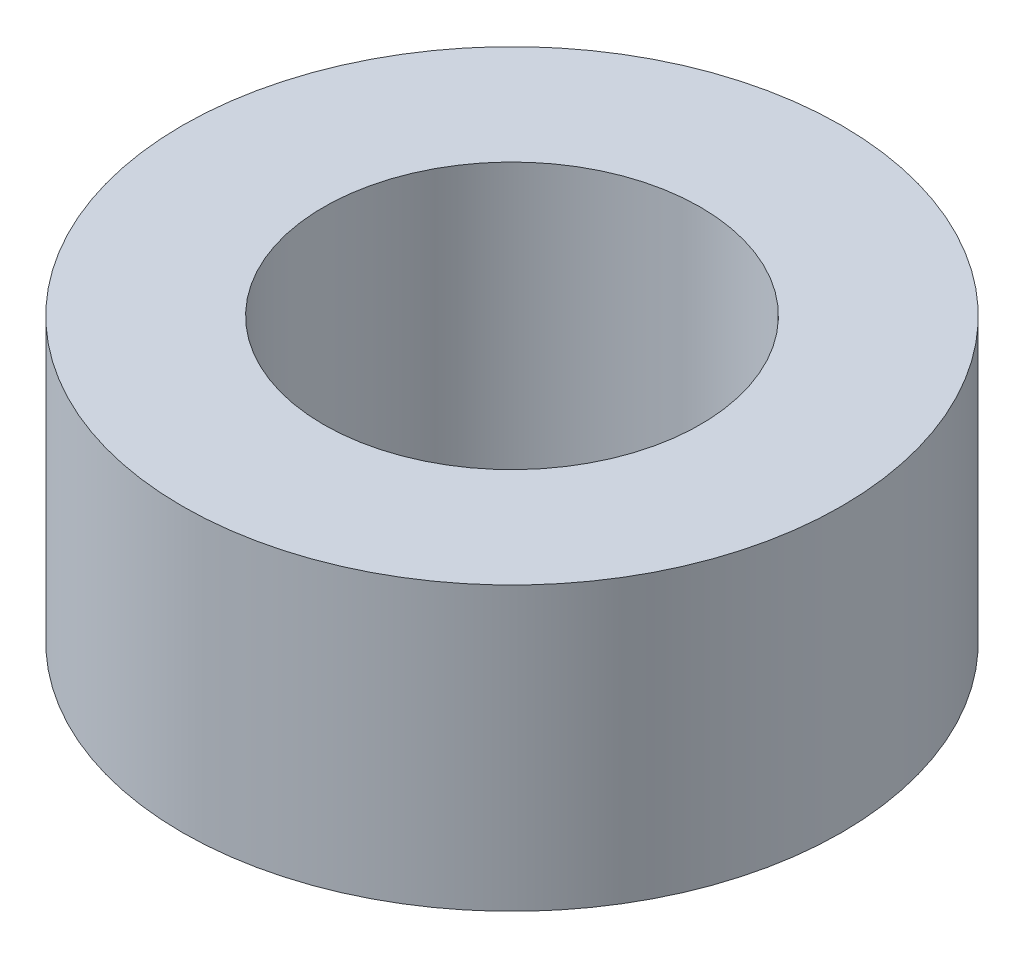
ISO-10303-21;
HEADER;
FILE_DESCRIPTION(('STEP AP214'),'2;1');
FILE_NAME('part.step','',(''),(''),'','','');
FILE_SCHEMA(('AUTOMOTIVE_DESIGN { 1 0 10303 214 1 1 1 1 }'));
ENDSEC;
DATA;
#1=APPLICATION_CONTEXT('core data for automotive mechanical design processes');
#2=APPLICATION_PROTOCOL_DEFINITION('international standard','automotive_design',2000,#1);
#3=PRODUCT_CONTEXT('',#1,'mechanical');
#4=PRODUCT('Part','Part','',(#3));
#5=PRODUCT_RELATED_PRODUCT_CATEGORY('part','',(#4));
#6=PRODUCT_DEFINITION_FORMATION('','',#4);
#7=PRODUCT_DEFINITION_CONTEXT('part definition',#1,'design');
#8=PRODUCT_DEFINITION('design','',#6,#7);
#9=PRODUCT_DEFINITION_SHAPE('','',#8);
#10=(LENGTH_UNIT() NAMED_UNIT(*) SI_UNIT(.MILLI.,.METRE.));
#11=(NAMED_UNIT(*) PLANE_ANGLE_UNIT() SI_UNIT($,.RADIAN.));
#12=(NAMED_UNIT(*) SI_UNIT($,.STERADIAN.) SOLID_ANGLE_UNIT());
#13=UNCERTAINTY_MEASURE_WITH_UNIT(LENGTH_MEASURE(1.E-05),#10,'distance_accuracy_value','');
#14=(GEOMETRIC_REPRESENTATION_CONTEXT(3) GLOBAL_UNCERTAINTY_ASSIGNED_CONTEXT((#13)) GLOBAL_UNIT_ASSIGNED_CONTEXT((#10,
#11,#12)) REPRESENTATION_CONTEXT('',''));
#15=CARTESIAN_POINT('',(0.,0.,0.));
#16=DIRECTION('',(0.,0.,1.));
#17=DIRECTION('',(1.,0.,0.));
#18=AXIS2_PLACEMENT_3D('',#15,#16,#17);
#19=CARTESIAN_POINT('',(0.,3.,0.));
#20=DIRECTION('',(0.,1.,0.));
#21=DIRECTION('',(0.,0.,1.));
#22=AXIS2_PLACEMENT_3D('',#19,#20,#21);
#23=PLANE('',#22);
#24=CARTESIAN_POINT('',(0.,3.,0.));
#25=DIRECTION('',(0.,1.,0.));
#26=DIRECTION('',(0.,0.,1.));
#27=AXIS2_PLACEMENT_3D('',#24,#25,#26);
#28=CIRCLE('',#27,3.5);
#29=CARTESIAN_POINT('',(0.,3.,3.5));
#30=VERTEX_POINT('',#29);
#31=EDGE_CURVE('E10',#30,#30,#28,.T.);
#32=ORIENTED_EDGE('',*,*,#31,.T.);
#33=EDGE_LOOP('',(#32));
#34=FACE_BOUND('',#33,.T.);
#35=CARTESIAN_POINT('',(0.,3.,0.));
#36=DIRECTION('',(0.,1.,0.));
#37=DIRECTION('',(0.,0.,1.));
#38=AXIS2_PLACEMENT_3D('',#35,#36,#37);
#39=CIRCLE('',#38,2.);
#40=CARTESIAN_POINT('',(0.,3.,2.));
#41=VERTEX_POINT('',#40);
#42=EDGE_CURVE('E39',#41,#41,#39,.T.);
#43=ORIENTED_EDGE('',*,*,#42,.F.);
#44=EDGE_LOOP('',(#43));
#45=FACE_BOUND('',#44,.T.);
#46=ADVANCED_FACE('F28',(#34,#45),#23,.T.);
#47=CARTESIAN_POINT('',(0.,0.,0.));
#48=DIRECTION('',(0.,1.,0.));
#49=DIRECTION('',(0.,0.,1.));
#50=AXIS2_PLACEMENT_3D('',#47,#48,#49);
#51=PLANE('',#50);
#52=CARTESIAN_POINT('',(0.,0.,0.));
#53=DIRECTION('',(0.,1.,0.));
#54=DIRECTION('',(0.,0.,1.));
#55=AXIS2_PLACEMENT_3D('',#52,#53,#54);
#56=CIRCLE('',#55,3.5);
#57=CARTESIAN_POINT('',(0.,0.,3.5));
#58=VERTEX_POINT('',#57);
#59=EDGE_CURVE('E32',#58,#58,#56,.T.);
#60=ORIENTED_EDGE('',*,*,#59,.F.);
#61=EDGE_LOOP('',(#60));
#62=FACE_BOUND('',#61,.T.);
#63=CARTESIAN_POINT('',(0.,0.,0.));
#64=DIRECTION('',(0.,1.,0.));
#65=DIRECTION('',(0.,0.,1.));
#66=AXIS2_PLACEMENT_3D('',#63,#64,#65);
#67=CIRCLE('',#66,2.);
#68=CARTESIAN_POINT('',(0.,0.,2.));
#69=VERTEX_POINT('',#68);
#70=EDGE_CURVE('E41',#69,#69,#67,.T.);
#71=ORIENTED_EDGE('',*,*,#70,.T.);
#72=EDGE_LOOP('',(#71));
#73=FACE_BOUND('',#72,.T.);
#74=ADVANCED_FACE('F51',(#62,#73),#51,.F.);
#75=CARTESIAN_POINT('',(0.,3.,0.));
#76=DIRECTION('',(0.,-1.,0.));
#77=DIRECTION('',(0.,0.,-1.));
#78=AXIS2_PLACEMENT_3D('',#75,#76,#77);
#79=CYLINDRICAL_SURFACE('',#78,3.5);
#80=ORIENTED_EDGE('',*,*,#31,.F.);
#81=EDGE_LOOP('',(#80));
#82=FACE_BOUND('',#81,.T.);
#83=ORIENTED_EDGE('',*,*,#59,.T.);
#84=EDGE_LOOP('',(#83));
#85=FACE_BOUND('',#84,.T.);
#86=ADVANCED_FACE('F30',(#82,#85),#79,.T.);
#87=CARTESIAN_POINT('',(0.,3.,0.));
#88=DIRECTION('',(0.,-1.,0.));
#89=DIRECTION('',(0.,0.,-1.));
#90=AXIS2_PLACEMENT_3D('',#87,#88,#89);
#91=CYLINDRICAL_SURFACE('',#90,2.);
#92=ORIENTED_EDGE('',*,*,#42,.T.);
#93=EDGE_LOOP('',(#92));
#94=FACE_BOUND('',#93,.T.);
#95=ORIENTED_EDGE('',*,*,#70,.F.);
#96=EDGE_LOOP('',(#95));
#97=FACE_BOUND('',#96,.T.);
#98=ADVANCED_FACE('F47',(#94,#97),#91,.F.);
#99=CLOSED_SHELL('',(#46,#74,#86,#98));
#100=MANIFOLD_SOLID_BREP('B2',#99);
#101=ADVANCED_BREP_SHAPE_REPRESENTATION('',(#18,#100),#14);
#102=SHAPE_DEFINITION_REPRESENTATION(#9,#101);
ENDSEC;
END-ISO-10303-21;
